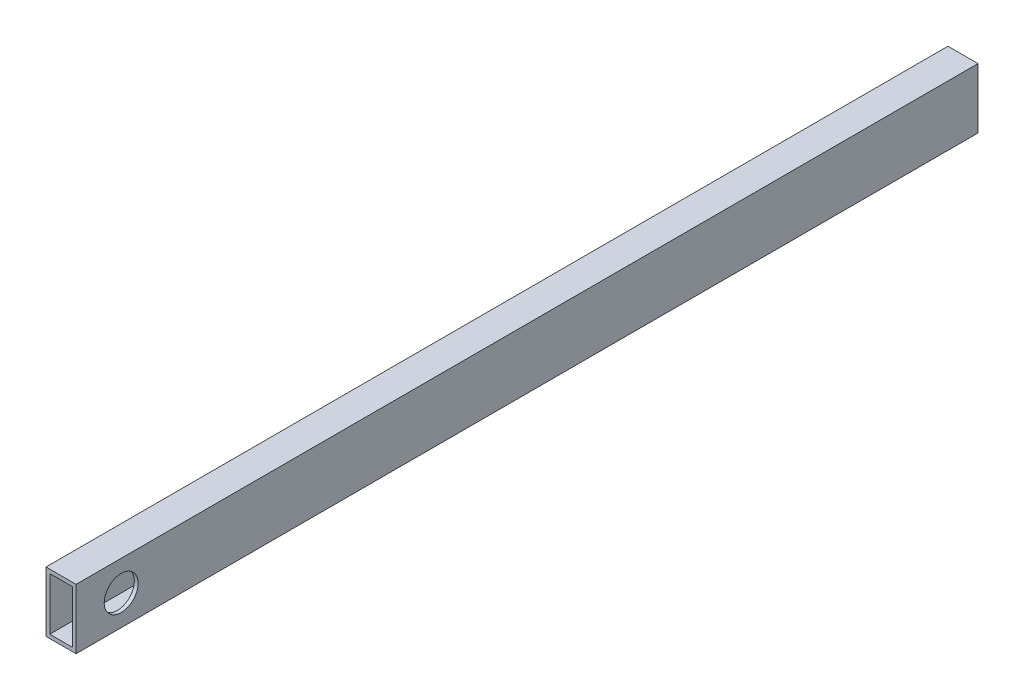
ISO-10303-21;
HEADER;
FILE_DESCRIPTION(('STEP AP214'),'2;1');
FILE_NAME('part.step','',(''),(''),'','','');
FILE_SCHEMA(('AUTOMOTIVE_DESIGN { 1 0 10303 214 1 1 1 1 }'));
ENDSEC;
DATA;
#1=APPLICATION_CONTEXT('core data for automotive mechanical design processes');
#2=APPLICATION_PROTOCOL_DEFINITION('international standard','automotive_design',2000,#1);
#3=PRODUCT_CONTEXT('',#1,'mechanical');
#4=PRODUCT('Part','Part','',(#3));
#5=PRODUCT_RELATED_PRODUCT_CATEGORY('part','',(#4));
#6=PRODUCT_DEFINITION_FORMATION('','',#4);
#7=PRODUCT_DEFINITION_CONTEXT('part definition',#1,'design');
#8=PRODUCT_DEFINITION('design','',#6,#7);
#9=PRODUCT_DEFINITION_SHAPE('','',#8);
#10=(LENGTH_UNIT() NAMED_UNIT(*) SI_UNIT(.MILLI.,.METRE.));
#11=(NAMED_UNIT(*) PLANE_ANGLE_UNIT() SI_UNIT($,.RADIAN.));
#12=(NAMED_UNIT(*) SI_UNIT($,.STERADIAN.) SOLID_ANGLE_UNIT());
#13=UNCERTAINTY_MEASURE_WITH_UNIT(LENGTH_MEASURE(1.E-05),#10,'distance_accuracy_value','');
#14=(GEOMETRIC_REPRESENTATION_CONTEXT(3) GLOBAL_UNCERTAINTY_ASSIGNED_CONTEXT((#13)) GLOBAL_UNIT_ASSIGNED_CONTEXT((#10,
#11,#12)) REPRESENTATION_CONTEXT('',''));
#15=CARTESIAN_POINT('',(0.,0.,0.));
#16=DIRECTION('',(0.,0.,1.));
#17=DIRECTION('',(1.,0.,0.));
#18=AXIS2_PLACEMENT_3D('',#15,#16,#17);
#19=CARTESIAN_POINT('',(0.,0.,762.));
#20=DIRECTION('',(0.,0.,-1.));
#21=DIRECTION('',(-1.,0.,0.));
#22=AXIS2_PLACEMENT_3D('',#19,#20,#21);
#23=PLANE('',#22);
#24=DIRECTION('',(0.,1.,0.));
#25=VECTOR('',#24,1.);
#26=CARTESIAN_POINT('',(12.7,-25.4,762.));
#27=LINE('',#26,#25);
#28=CARTESIAN_POINT('',(12.7,-25.4,762.));
#29=VERTEX_POINT('',#28);
#30=CARTESIAN_POINT('',(12.7,25.4,762.));
#31=VERTEX_POINT('',#30);
#32=EDGE_CURVE('E137',#29,#31,#27,.T.);
#33=ORIENTED_EDGE('',*,*,#32,.T.);
#34=DIRECTION('',(-1.,0.,0.));
#35=VECTOR('',#34,1.);
#36=CARTESIAN_POINT('',(-12.7,25.4,762.));
#37=LINE('',#36,#35);
#38=CARTESIAN_POINT('',(-12.7,25.4,762.));
#39=VERTEX_POINT('',#38);
#40=EDGE_CURVE('E140',#31,#39,#37,.T.);
#41=ORIENTED_EDGE('',*,*,#40,.T.);
#42=DIRECTION('',(0.,-1.,0.));
#43=VECTOR('',#42,1.);
#44=CARTESIAN_POINT('',(-12.7,-25.4,762.));
#45=LINE('',#44,#43);
#46=CARTESIAN_POINT('',(-12.7,-25.4,762.));
#47=VERTEX_POINT('',#46);
#48=EDGE_CURVE('E143',#39,#47,#45,.T.);
#49=ORIENTED_EDGE('',*,*,#48,.T.);
#50=DIRECTION('',(1.,0.,0.));
#51=VECTOR('',#50,1.);
#52=CARTESIAN_POINT('',(-12.7,-25.4,762.));
#53=LINE('',#52,#51);
#54=EDGE_CURVE('E145',#47,#29,#53,.T.);
#55=ORIENTED_EDGE('',*,*,#54,.T.);
#56=EDGE_LOOP('',(#33,#41,#49,#55));
#57=FACE_BOUND('',#56,.T.);
#58=DIRECTION('',(0.,-1.,0.));
#59=VECTOR('',#58,1.);
#60=CARTESIAN_POINT('',(-9.525,-22.225,762.));
#61=LINE('',#60,#59);
#62=CARTESIAN_POINT('',(-9.525,22.225,762.));
#63=VERTEX_POINT('',#62);
#64=CARTESIAN_POINT('',(-9.525,-22.225,762.));
#65=VERTEX_POINT('',#64);
#66=EDGE_CURVE('E99',#63,#65,#61,.T.);
#67=ORIENTED_EDGE('',*,*,#66,.F.);
#68=DIRECTION('',(-1.,0.,0.));
#69=VECTOR('',#68,1.);
#70=CARTESIAN_POINT('',(-9.525,22.225,762.));
#71=LINE('',#70,#69);
#72=CARTESIAN_POINT('',(9.525,22.225,762.));
#73=VERTEX_POINT('',#72);
#74=EDGE_CURVE('E121',#73,#63,#71,.T.);
#75=ORIENTED_EDGE('',*,*,#74,.F.);
#76=DIRECTION('',(0.,1.,0.));
#77=VECTOR('',#76,1.);
#78=CARTESIAN_POINT('',(9.525,-22.225,762.));
#79=LINE('',#78,#77);
#80=CARTESIAN_POINT('',(9.525,-22.225,762.));
#81=VERTEX_POINT('',#80);
#82=EDGE_CURVE('E119',#81,#73,#79,.T.);
#83=ORIENTED_EDGE('',*,*,#82,.F.);
#84=DIRECTION('',(1.,0.,0.));
#85=VECTOR('',#84,1.);
#86=CARTESIAN_POINT('',(-9.525,-22.225,762.));
#87=LINE('',#86,#85);
#88=EDGE_CURVE('E107',#65,#81,#87,.T.);
#89=ORIENTED_EDGE('',*,*,#88,.F.);
#90=EDGE_LOOP('',(#67,#75,#83,#89));
#91=FACE_BOUND('',#90,.T.);
#92=ADVANCED_FACE('F33',(#57,#91),#23,.F.);
#93=CARTESIAN_POINT('',(0.,0.,0.));
#94=DIRECTION('',(0.,0.,-1.));
#95=DIRECTION('',(-1.,0.,0.));
#96=AXIS2_PLACEMENT_3D('',#93,#94,#95);
#97=PLANE('',#96);
#98=DIRECTION('',(0.,1.,0.));
#99=VECTOR('',#98,1.);
#100=CARTESIAN_POINT('',(12.7,-25.4,0.));
#101=LINE('',#100,#99);
#102=CARTESIAN_POINT('',(12.7,-25.4,0.));
#103=VERTEX_POINT('',#102);
#104=CARTESIAN_POINT('',(12.7,25.4,0.));
#105=VERTEX_POINT('',#104);
#106=EDGE_CURVE('E115',#103,#105,#101,.T.);
#107=ORIENTED_EDGE('',*,*,#106,.F.);
#108=DIRECTION('',(1.,0.,0.));
#109=VECTOR('',#108,1.);
#110=CARTESIAN_POINT('',(-12.7,-25.4,0.));
#111=LINE('',#110,#109);
#112=CARTESIAN_POINT('',(-12.7,-25.4,0.));
#113=VERTEX_POINT('',#112);
#114=EDGE_CURVE('E141',#113,#103,#111,.T.);
#115=ORIENTED_EDGE('',*,*,#114,.F.);
#116=DIRECTION('',(0.,-1.,0.));
#117=VECTOR('',#116,1.);
#118=CARTESIAN_POINT('',(-12.7,-25.4,0.));
#119=LINE('',#118,#117);
#120=CARTESIAN_POINT('',(-12.7,25.4,0.));
#121=VERTEX_POINT('',#120);
#122=EDGE_CURVE('E152',#121,#113,#119,.T.);
#123=ORIENTED_EDGE('',*,*,#122,.F.);
#124=DIRECTION('',(-1.,0.,0.));
#125=VECTOR('',#124,1.);
#126=CARTESIAN_POINT('',(-12.7,25.4,0.));
#127=LINE('',#126,#125);
#128=EDGE_CURVE('E150',#105,#121,#127,.T.);
#129=ORIENTED_EDGE('',*,*,#128,.F.);
#130=EDGE_LOOP('',(#107,#115,#123,#129));
#131=FACE_BOUND('',#130,.T.);
#132=DIRECTION('',(-1.,0.,0.));
#133=VECTOR('',#132,1.);
#134=CARTESIAN_POINT('',(-9.525,22.225,0.));
#135=LINE('',#134,#133);
#136=CARTESIAN_POINT('',(9.525,22.225,0.));
#137=VERTEX_POINT('',#136);
#138=CARTESIAN_POINT('',(-9.525,22.225,0.));
#139=VERTEX_POINT('',#138);
#140=EDGE_CURVE('E108',#137,#139,#135,.T.);
#141=ORIENTED_EDGE('',*,*,#140,.T.);
#142=DIRECTION('',(0.,-1.,0.));
#143=VECTOR('',#142,1.);
#144=CARTESIAN_POINT('',(-9.525,-22.225,0.));
#145=LINE('',#144,#143);
#146=CARTESIAN_POINT('',(-9.525,-22.225,0.));
#147=VERTEX_POINT('',#146);
#148=EDGE_CURVE('E57',#139,#147,#145,.T.);
#149=ORIENTED_EDGE('',*,*,#148,.T.);
#150=DIRECTION('',(1.,0.,0.));
#151=VECTOR('',#150,1.);
#152=CARTESIAN_POINT('',(-9.525,-22.225,0.));
#153=LINE('',#152,#151);
#154=CARTESIAN_POINT('',(9.525,-22.225,0.));
#155=VERTEX_POINT('',#154);
#156=EDGE_CURVE('E114',#147,#155,#153,.T.);
#157=ORIENTED_EDGE('',*,*,#156,.T.);
#158=DIRECTION('',(0.,1.,0.));
#159=VECTOR('',#158,1.);
#160=CARTESIAN_POINT('',(9.525,-22.225,0.));
#161=LINE('',#160,#159);
#162=EDGE_CURVE('E129',#155,#137,#161,.T.);
#163=ORIENTED_EDGE('',*,*,#162,.T.);
#164=EDGE_LOOP('',(#141,#149,#157,#163));
#165=FACE_BOUND('',#164,.T.);
#166=ADVANCED_FACE('F171',(#131,#165),#97,.T.);
#167=CARTESIAN_POINT('',(12.7,-25.4,762.));
#168=DIRECTION('',(-1.,0.,0.));
#169=DIRECTION('',(0.,0.,1.));
#170=AXIS2_PLACEMENT_3D('',#167,#168,#169);
#171=PLANE('',#170);
#172=CARTESIAN_POINT('',(12.7,0.,723.9));
#173=DIRECTION('',(-1.,0.,0.));
#174=DIRECTION('',(0.,0.,1.));
#175=AXIS2_PLACEMENT_3D('',#172,#173,#174);
#176=CIRCLE('',#175,14.3129);
#177=CARTESIAN_POINT('',(12.7,0.,738.2129));
#178=VERTEX_POINT('',#177);
#179=EDGE_CURVE('E215',#178,#178,#176,.T.);
#180=ORIENTED_EDGE('',*,*,#179,.T.);
#181=EDGE_LOOP('',(#180));
#182=FACE_BOUND('',#181,.T.);
#183=ORIENTED_EDGE('',*,*,#106,.T.);
#184=DIRECTION('',(0.,0.,-1.));
#185=VECTOR('',#184,1.);
#186=CARTESIAN_POINT('',(12.7,25.4,762.));
#187=LINE('',#186,#185);
#188=EDGE_CURVE('E11',#31,#105,#187,.T.);
#189=ORIENTED_EDGE('',*,*,#188,.F.);
#190=ORIENTED_EDGE('',*,*,#32,.F.);
#191=DIRECTION('',(0.,0.,-1.));
#192=VECTOR('',#191,1.);
#193=CARTESIAN_POINT('',(12.7,-25.4,762.));
#194=LINE('',#193,#192);
#195=EDGE_CURVE('E147',#29,#103,#194,.T.);
#196=ORIENTED_EDGE('',*,*,#195,.T.);
#197=EDGE_LOOP('',(#183,#189,#190,#196));
#198=FACE_BOUND('',#197,.T.);
#199=ADVANCED_FACE('F35',(#182,#198),#171,.F.);
#200=CARTESIAN_POINT('',(-12.7,25.4,762.));
#201=DIRECTION('',(0.,-1.,0.));
#202=DIRECTION('',(0.,0.,-1.));
#203=AXIS2_PLACEMENT_3D('',#200,#201,#202);
#204=PLANE('',#203);
#205=ORIENTED_EDGE('',*,*,#128,.T.);
#206=DIRECTION('',(0.,0.,-1.));
#207=VECTOR('',#206,1.);
#208=CARTESIAN_POINT('',(-12.7,25.4,762.));
#209=LINE('',#208,#207);
#210=EDGE_CURVE('E42',#39,#121,#209,.T.);
#211=ORIENTED_EDGE('',*,*,#210,.F.);
#212=ORIENTED_EDGE('',*,*,#40,.F.);
#213=ORIENTED_EDGE('',*,*,#188,.T.);
#214=EDGE_LOOP('',(#205,#211,#212,#213));
#215=FACE_BOUND('',#214,.T.);
#216=ADVANCED_FACE('F181',(#215),#204,.F.);
#217=CARTESIAN_POINT('',(-12.7,-25.4,762.));
#218=DIRECTION('',(1.,0.,0.));
#219=DIRECTION('',(0.,0.,-1.));
#220=AXIS2_PLACEMENT_3D('',#217,#218,#219);
#221=PLANE('',#220);
#222=CARTESIAN_POINT('',(-12.7,0.,723.9));
#223=DIRECTION('',(-1.,0.,0.));
#224=DIRECTION('',(0.,0.,1.));
#225=AXIS2_PLACEMENT_3D('',#222,#223,#224);
#226=CIRCLE('',#225,14.3129);
#227=CARTESIAN_POINT('',(-12.7,0.,738.2129));
#228=VERTEX_POINT('',#227);
#229=EDGE_CURVE('E217',#228,#228,#226,.T.);
#230=ORIENTED_EDGE('',*,*,#229,.F.);
#231=EDGE_LOOP('',(#230));
#232=FACE_BOUND('',#231,.T.);
#233=ORIENTED_EDGE('',*,*,#122,.T.);
#234=DIRECTION('',(0.,0.,-1.));
#235=VECTOR('',#234,1.);
#236=CARTESIAN_POINT('',(-12.7,-25.4,762.));
#237=LINE('',#236,#235);
#238=EDGE_CURVE('E157',#47,#113,#237,.T.);
#239=ORIENTED_EDGE('',*,*,#238,.F.);
#240=ORIENTED_EDGE('',*,*,#48,.F.);
#241=ORIENTED_EDGE('',*,*,#210,.T.);
#242=EDGE_LOOP('',(#233,#239,#240,#241));
#243=FACE_BOUND('',#242,.T.);
#244=ADVANCED_FACE('F165',(#232,#243),#221,.F.);
#245=CARTESIAN_POINT('',(-12.7,-25.4,762.));
#246=DIRECTION('',(0.,1.,0.));
#247=DIRECTION('',(0.,0.,1.));
#248=AXIS2_PLACEMENT_3D('',#245,#246,#247);
#249=PLANE('',#248);
#250=ORIENTED_EDGE('',*,*,#114,.T.);
#251=ORIENTED_EDGE('',*,*,#195,.F.);
#252=ORIENTED_EDGE('',*,*,#54,.F.);
#253=ORIENTED_EDGE('',*,*,#238,.T.);
#254=EDGE_LOOP('',(#250,#251,#252,#253));
#255=FACE_BOUND('',#254,.T.);
#256=ADVANCED_FACE('F175',(#255),#249,.F.);
#257=CARTESIAN_POINT('',(-9.525,-22.225,762.));
#258=DIRECTION('',(1.,0.,0.));
#259=DIRECTION('',(0.,0.,-1.));
#260=AXIS2_PLACEMENT_3D('',#257,#258,#259);
#261=PLANE('',#260);
#262=CARTESIAN_POINT('',(-9.525,0.,723.9));
#263=DIRECTION('',(1.,0.,0.));
#264=DIRECTION('',(0.,0.,-1.));
#265=AXIS2_PLACEMENT_3D('',#262,#263,#264);
#266=CIRCLE('',#265,14.3129);
#267=CARTESIAN_POINT('',(-9.525,0.,709.5871));
#268=VERTEX_POINT('',#267);
#269=EDGE_CURVE('E127',#268,#268,#266,.T.);
#270=ORIENTED_EDGE('',*,*,#269,.F.);
#271=EDGE_LOOP('',(#270));
#272=FACE_BOUND('',#271,.T.);
#273=ORIENTED_EDGE('',*,*,#148,.F.);
#274=DIRECTION('',(0.,0.,-1.));
#275=VECTOR('',#274,1.);
#276=CARTESIAN_POINT('',(-9.525,22.225,762.));
#277=LINE('',#276,#275);
#278=EDGE_CURVE('E103',#63,#139,#277,.T.);
#279=ORIENTED_EDGE('',*,*,#278,.F.);
#280=ORIENTED_EDGE('',*,*,#66,.T.);
#281=DIRECTION('',(0.,0.,-1.));
#282=VECTOR('',#281,1.);
#283=CARTESIAN_POINT('',(-9.525,-22.225,762.));
#284=LINE('',#283,#282);
#285=EDGE_CURVE('E102',#65,#147,#284,.T.);
#286=ORIENTED_EDGE('',*,*,#285,.T.);
#287=EDGE_LOOP('',(#273,#279,#280,#286));
#288=FACE_BOUND('',#287,.T.);
#289=ADVANCED_FACE('F101',(#272,#288),#261,.T.);
#290=CARTESIAN_POINT('',(-9.525,-22.225,762.));
#291=DIRECTION('',(0.,1.,0.));
#292=DIRECTION('',(0.,0.,1.));
#293=AXIS2_PLACEMENT_3D('',#290,#291,#292);
#294=PLANE('',#293);
#295=ORIENTED_EDGE('',*,*,#156,.F.);
#296=ORIENTED_EDGE('',*,*,#285,.F.);
#297=ORIENTED_EDGE('',*,*,#88,.T.);
#298=DIRECTION('',(0.,0.,-1.));
#299=VECTOR('',#298,1.);
#300=CARTESIAN_POINT('',(9.525,-22.225,762.));
#301=LINE('',#300,#299);
#302=EDGE_CURVE('E116',#81,#155,#301,.T.);
#303=ORIENTED_EDGE('',*,*,#302,.T.);
#304=EDGE_LOOP('',(#295,#296,#297,#303));
#305=FACE_BOUND('',#304,.T.);
#306=ADVANCED_FACE('F111',(#305),#294,.T.);
#307=CARTESIAN_POINT('',(9.525,-22.225,762.));
#308=DIRECTION('',(-1.,0.,0.));
#309=DIRECTION('',(0.,-1.,0.));
#310=AXIS2_PLACEMENT_3D('',#307,#308,#309);
#311=PLANE('',#310);
#312=CARTESIAN_POINT('',(9.525,0.,723.9));
#313=DIRECTION('',(-1.,0.,0.));
#314=DIRECTION('',(0.,-1.,0.));
#315=AXIS2_PLACEMENT_3D('',#312,#313,#314);
#316=CIRCLE('',#315,14.3129);
#317=CARTESIAN_POINT('',(9.525,-14.3129,723.9));
#318=VERTEX_POINT('',#317);
#319=EDGE_CURVE('E37',#318,#318,#316,.T.);
#320=ORIENTED_EDGE('',*,*,#319,.F.);
#321=EDGE_LOOP('',(#320));
#322=FACE_BOUND('',#321,.T.);
#323=ORIENTED_EDGE('',*,*,#162,.F.);
#324=ORIENTED_EDGE('',*,*,#302,.F.);
#325=ORIENTED_EDGE('',*,*,#82,.T.);
#326=DIRECTION('',(0.,0.,-1.));
#327=VECTOR('',#326,1.);
#328=CARTESIAN_POINT('',(9.525,22.225,762.));
#329=LINE('',#328,#327);
#330=EDGE_CURVE('E49',#73,#137,#329,.T.);
#331=ORIENTED_EDGE('',*,*,#330,.T.);
#332=EDGE_LOOP('',(#323,#324,#325,#331));
#333=FACE_BOUND('',#332,.T.);
#334=ADVANCED_FACE('F210',(#322,#333),#311,.T.);
#335=CARTESIAN_POINT('',(-9.525,22.225,762.));
#336=DIRECTION('',(0.,-1.,0.));
#337=DIRECTION('',(1.,0.,0.));
#338=AXIS2_PLACEMENT_3D('',#335,#336,#337);
#339=PLANE('',#338);
#340=ORIENTED_EDGE('',*,*,#140,.F.);
#341=ORIENTED_EDGE('',*,*,#330,.F.);
#342=ORIENTED_EDGE('',*,*,#74,.T.);
#343=ORIENTED_EDGE('',*,*,#278,.T.);
#344=EDGE_LOOP('',(#340,#341,#342,#343));
#345=FACE_BOUND('',#344,.T.);
#346=ADVANCED_FACE('F226',(#345),#339,.T.);
#347=CARTESIAN_POINT('',(12.7,0.,723.9));
#348=DIRECTION('',(-1.,0.,0.));
#349=DIRECTION('',(0.,0.,1.));
#350=AXIS2_PLACEMENT_3D('',#347,#348,#349);
#351=CYLINDRICAL_SURFACE('',#350,14.3129);
#352=ORIENTED_EDGE('',*,*,#319,.T.);
#353=EDGE_LOOP('',(#352));
#354=FACE_BOUND('',#353,.T.);
#355=ORIENTED_EDGE('',*,*,#179,.F.);
#356=EDGE_LOOP('',(#355));
#357=FACE_BOUND('',#356,.T.);
#358=ADVANCED_FACE('F223',(#354,#357),#351,.F.);
#359=ORIENTED_EDGE('',*,*,#269,.T.);
#360=EDGE_LOOP('',(#359));
#361=FACE_BOUND('',#360,.T.);
#362=ORIENTED_EDGE('',*,*,#229,.T.);
#363=EDGE_LOOP('',(#362));
#364=FACE_BOUND('',#363,.T.);
#365=ADVANCED_FACE('F225',(#361,#364),#351,.F.);
#366=CLOSED_SHELL('',(#92,#166,#199,#216,#244,#256,#289,#306,#334,#346,#358,#365));
#367=MANIFOLD_SOLID_BREP('B2',#366);
#368=ADVANCED_BREP_SHAPE_REPRESENTATION('',(#18,#367),#14);
#369=SHAPE_DEFINITION_REPRESENTATION(#9,#368);
ENDSEC;
END-ISO-10303-21;
